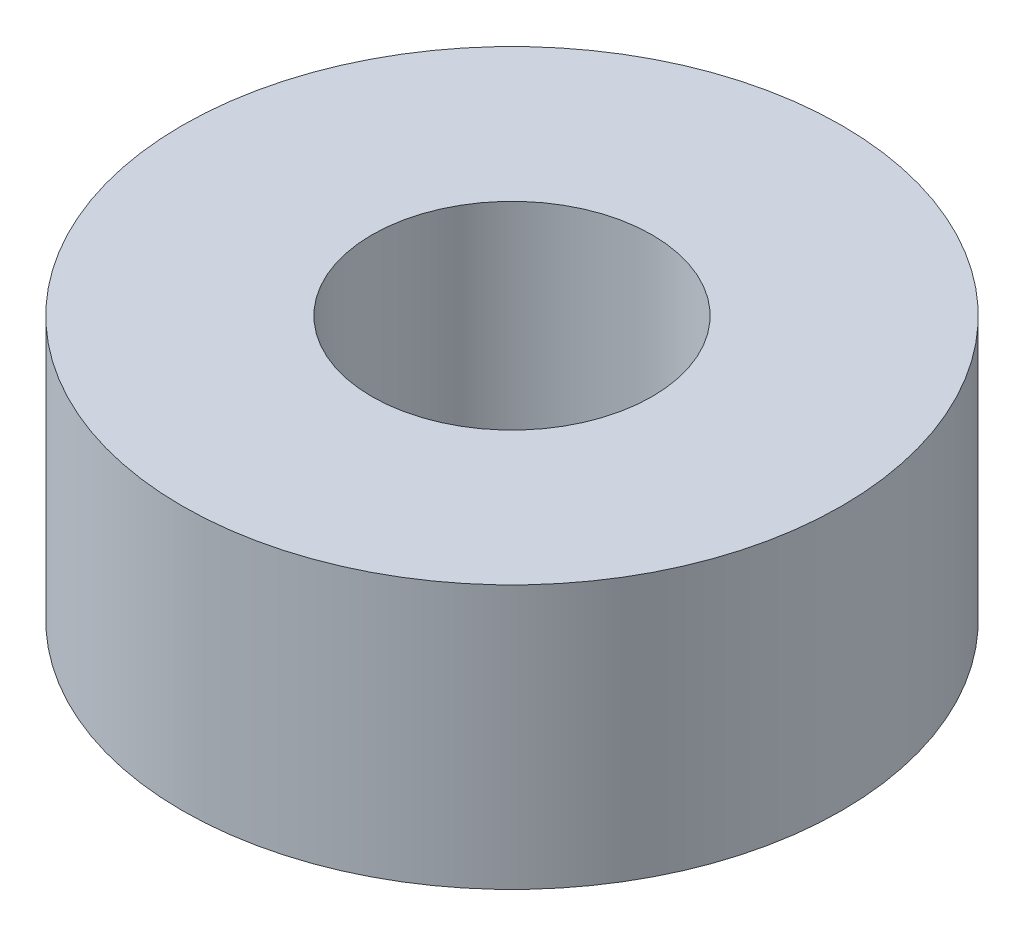
ISO-10303-21;
HEADER;
FILE_DESCRIPTION(('STEP AP214'),'2;1');
FILE_NAME('part.step','',(''),(''),'','','');
FILE_SCHEMA(('AUTOMOTIVE_DESIGN { 1 0 10303 214 1 1 1 1 }'));
ENDSEC;
DATA;
#1=APPLICATION_CONTEXT('core data for automotive mechanical design processes');
#2=APPLICATION_PROTOCOL_DEFINITION('international standard','automotive_design',2000,#1);
#3=PRODUCT_CONTEXT('',#1,'mechanical');
#4=PRODUCT('Part','Part','',(#3));
#5=PRODUCT_RELATED_PRODUCT_CATEGORY('part','',(#4));
#6=PRODUCT_DEFINITION_FORMATION('','',#4);
#7=PRODUCT_DEFINITION_CONTEXT('part definition',#1,'design');
#8=PRODUCT_DEFINITION('design','',#6,#7);
#9=PRODUCT_DEFINITION_SHAPE('','',#8);
#10=(LENGTH_UNIT() NAMED_UNIT(*) SI_UNIT(.MILLI.,.METRE.));
#11=(NAMED_UNIT(*) PLANE_ANGLE_UNIT() SI_UNIT($,.RADIAN.));
#12=(NAMED_UNIT(*) SI_UNIT($,.STERADIAN.) SOLID_ANGLE_UNIT());
#13=UNCERTAINTY_MEASURE_WITH_UNIT(LENGTH_MEASURE(1.E-05),#10,'distance_accuracy_value','');
#14=(GEOMETRIC_REPRESENTATION_CONTEXT(3) GLOBAL_UNCERTAINTY_ASSIGNED_CONTEXT((#13)) GLOBAL_UNIT_ASSIGNED_CONTEXT((#10,
#11,#12)) REPRESENTATION_CONTEXT('',''));
#15=CARTESIAN_POINT('',(0.,0.,0.));
#16=DIRECTION('',(0.,0.,1.));
#17=DIRECTION('',(1.,0.,0.));
#18=AXIS2_PLACEMENT_3D('',#15,#16,#17);
#19=CARTESIAN_POINT('',(0.,4.,171.45));
#20=DIRECTION('',(0.,-1.,0.));
#21=DIRECTION('',(0.,0.,-1.));
#22=AXIS2_PLACEMENT_3D('',#19,#20,#21);
#23=CYLINDRICAL_SURFACE('',#22,10.);
#24=CARTESIAN_POINT('',(0.,4.,171.45));
#25=DIRECTION('',(0.,1.,0.));
#26=DIRECTION('',(0.,0.,1.));
#27=AXIS2_PLACEMENT_3D('',#24,#25,#26);
#28=CIRCLE('',#27,10.);
#29=CARTESIAN_POINT('',(0.,4.,181.45));
#30=VERTEX_POINT('',#29);
#31=EDGE_CURVE('E10',#30,#30,#28,.T.);
#32=ORIENTED_EDGE('',*,*,#31,.F.);
#33=EDGE_LOOP('',(#32));
#34=FACE_BOUND('',#33,.T.);
#35=CARTESIAN_POINT('',(0.,-4.,171.45));
#36=DIRECTION('',(0.,1.,0.));
#37=DIRECTION('',(0.,0.,1.));
#38=AXIS2_PLACEMENT_3D('',#35,#36,#37);
#39=CIRCLE('',#38,10.);
#40=CARTESIAN_POINT('',(0.,-4.,181.45));
#41=VERTEX_POINT('',#40);
#42=EDGE_CURVE('E46',#41,#41,#39,.T.);
#43=ORIENTED_EDGE('',*,*,#42,.T.);
#44=EDGE_LOOP('',(#43));
#45=FACE_BOUND('',#44,.T.);
#46=ADVANCED_FACE('F43',(#34,#45),#23,.T.);
#47=CARTESIAN_POINT('',(0.,4.,171.45));
#48=DIRECTION('',(0.,1.,0.));
#49=DIRECTION('',(0.,0.,1.));
#50=AXIS2_PLACEMENT_3D('',#47,#48,#49);
#51=PLANE('',#50);
#52=CARTESIAN_POINT('',(0.,4.,171.45));
#53=DIRECTION('',(0.,1.,0.));
#54=DIRECTION('',(0.,0.,1.));
#55=AXIS2_PLACEMENT_3D('',#52,#53,#54);
#56=CIRCLE('',#55,4.25);
#57=CARTESIAN_POINT('',(0.,4.,175.7));
#58=VERTEX_POINT('',#57);
#59=EDGE_CURVE('E54',#58,#58,#56,.T.);
#60=ORIENTED_EDGE('',*,*,#59,.F.);
#61=EDGE_LOOP('',(#60));
#62=FACE_BOUND('',#61,.T.);
#63=ORIENTED_EDGE('',*,*,#31,.T.);
#64=EDGE_LOOP('',(#63));
#65=FACE_BOUND('',#64,.T.);
#66=ADVANCED_FACE('F70',(#62,#65),#51,.T.);
#67=CARTESIAN_POINT('',(0.,-4.,171.45));
#68=DIRECTION('',(0.,1.,0.));
#69=DIRECTION('',(0.,0.,1.));
#70=AXIS2_PLACEMENT_3D('',#67,#68,#69);
#71=PLANE('',#70);
#72=CARTESIAN_POINT('',(0.,-4.,171.45));
#73=DIRECTION('',(0.,1.,0.));
#74=DIRECTION('',(0.,0.,1.));
#75=AXIS2_PLACEMENT_3D('',#72,#73,#74);
#76=CIRCLE('',#75,4.25);
#77=CARTESIAN_POINT('',(0.,-4.,175.7));
#78=VERTEX_POINT('',#77);
#79=EDGE_CURVE('E60',#78,#78,#76,.T.);
#80=ORIENTED_EDGE('',*,*,#79,.T.);
#81=EDGE_LOOP('',(#80));
#82=FACE_BOUND('',#81,.T.);
#83=ORIENTED_EDGE('',*,*,#42,.F.);
#84=EDGE_LOOP('',(#83));
#85=FACE_BOUND('',#84,.T.);
#86=ADVANCED_FACE('F68',(#82,#85),#71,.F.);
#87=CARTESIAN_POINT('',(0.,4.,171.45));
#88=DIRECTION('',(0.,-1.,0.));
#89=DIRECTION('',(0.,0.,-1.));
#90=AXIS2_PLACEMENT_3D('',#87,#88,#89);
#91=CYLINDRICAL_SURFACE('',#90,4.25);
#92=ORIENTED_EDGE('',*,*,#59,.T.);
#93=EDGE_LOOP('',(#92));
#94=FACE_BOUND('',#93,.T.);
#95=ORIENTED_EDGE('',*,*,#79,.F.);
#96=EDGE_LOOP('',(#95));
#97=FACE_BOUND('',#96,.T.);
#98=ADVANCED_FACE('F62',(#94,#97),#91,.F.);
#99=CLOSED_SHELL('',(#46,#66,#86,#98));
#100=MANIFOLD_SOLID_BREP('B2',#99);
#101=ADVANCED_BREP_SHAPE_REPRESENTATION('',(#18,#100),#14);
#102=SHAPE_DEFINITION_REPRESENTATION(#9,#101);
ENDSEC;
END-ISO-10303-21;
